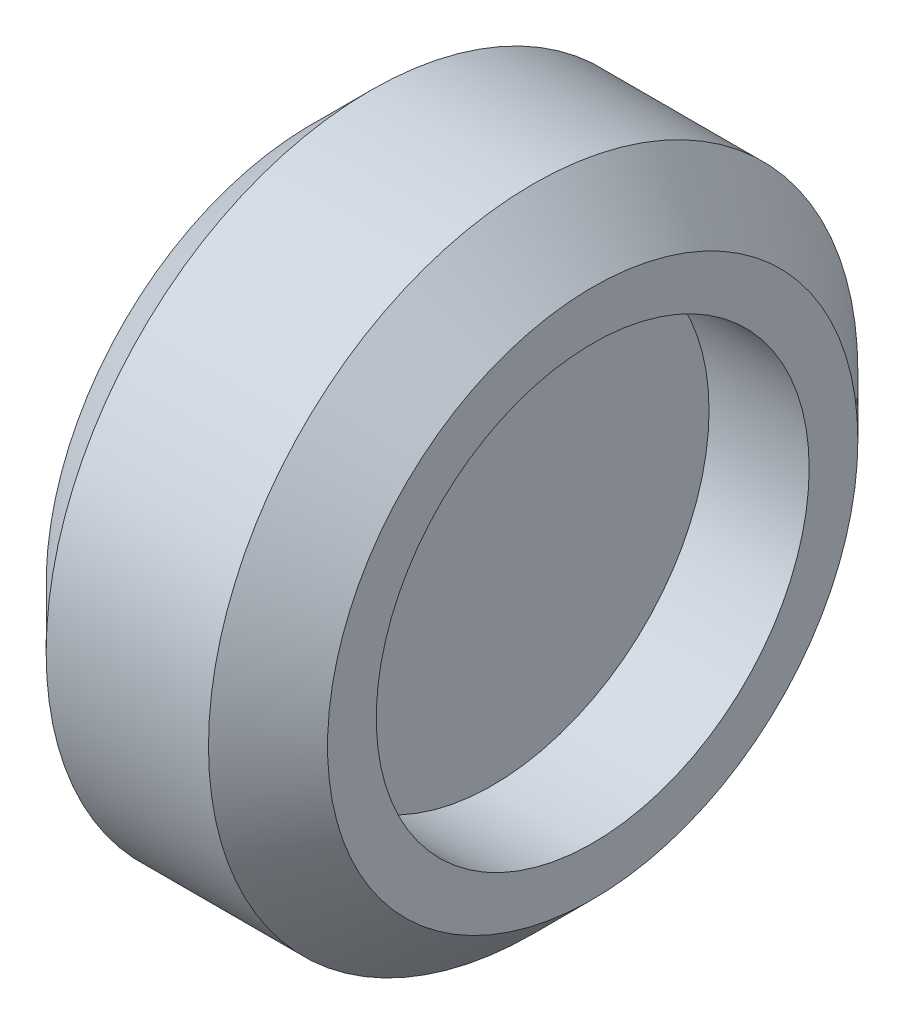
ISO-10303-21;
HEADER;
FILE_DESCRIPTION(('STEP AP214'),'2;1');
FILE_NAME('part.step','',(''),(''),'','','');
FILE_SCHEMA(('AUTOMOTIVE_DESIGN { 1 0 10303 214 1 1 1 1 }'));
ENDSEC;
DATA;
#1=APPLICATION_CONTEXT('core data for automotive mechanical design processes');
#2=APPLICATION_PROTOCOL_DEFINITION('international standard','automotive_design',2000,#1);
#3=PRODUCT_CONTEXT('',#1,'mechanical');
#4=PRODUCT('Part','Part','',(#3));
#5=PRODUCT_RELATED_PRODUCT_CATEGORY('part','',(#4));
#6=PRODUCT_DEFINITION_FORMATION('','',#4);
#7=PRODUCT_DEFINITION_CONTEXT('part definition',#1,'design');
#8=PRODUCT_DEFINITION('design','',#6,#7);
#9=PRODUCT_DEFINITION_SHAPE('','',#8);
#10=(LENGTH_UNIT() NAMED_UNIT(*) SI_UNIT(.MILLI.,.METRE.));
#11=(NAMED_UNIT(*) PLANE_ANGLE_UNIT() SI_UNIT($,.RADIAN.));
#12=(NAMED_UNIT(*) SI_UNIT($,.STERADIAN.) SOLID_ANGLE_UNIT());
#13=UNCERTAINTY_MEASURE_WITH_UNIT(LENGTH_MEASURE(1.E-05),#10,'distance_accuracy_value','');
#14=(GEOMETRIC_REPRESENTATION_CONTEXT(3) GLOBAL_UNCERTAINTY_ASSIGNED_CONTEXT((#13)) GLOBAL_UNIT_ASSIGNED_CONTEXT((#10,
#11,#12)) REPRESENTATION_CONTEXT('',''));
#15=CARTESIAN_POINT('',(0.,0.,0.));
#16=DIRECTION('',(0.,0.,1.));
#17=DIRECTION('',(1.,0.,0.));
#18=AXIS2_PLACEMENT_3D('',#15,#16,#17);
#19=CARTESIAN_POINT('',(0.,0.,0.));
#20=DIRECTION('',(-1.,0.,0.));
#21=DIRECTION('',(0.,0.,1.));
#22=AXIS2_PLACEMENT_3D('',#19,#20,#21);
#23=CYLINDRICAL_SURFACE('',#22,12.);
#24=CARTESIAN_POINT('',(-3.,0.,0.));
#25=DIRECTION('',(-1.,0.,0.));
#26=DIRECTION('',(0.,0.,1.));
#27=AXIS2_PLACEMENT_3D('',#24,#25,#26);
#28=CIRCLE('',#27,12.);
#29=CARTESIAN_POINT('',(-3.,0.,-12.));
#30=VERTEX_POINT('',#29);
#31=EDGE_CURVE('E75',#30,#30,#28,.T.);
#32=ORIENTED_EDGE('',*,*,#31,.F.);
#33=DIRECTION('',(1.,0.,0.));
#34=VECTOR('',#33,1.);
#35=CARTESIAN_POINT('',(0.,0.,-12.));
#36=LINE('',#35,#34);
#37=CARTESIAN_POINT('',(3.,0.,-12.));
#38=VERTEX_POINT('',#37);
#39=EDGE_CURVE('E11',#30,#38,#36,.T.);
#40=ORIENTED_EDGE('',*,*,#39,.T.);
#41=CARTESIAN_POINT('',(3.,0.,0.));
#42=DIRECTION('',(-1.,0.,0.));
#43=DIRECTION('',(0.,0.,1.));
#44=AXIS2_PLACEMENT_3D('',#41,#42,#43);
#45=CIRCLE('',#44,12.);
#46=EDGE_CURVE('E95',#38,#38,#45,.T.);
#47=ORIENTED_EDGE('',*,*,#46,.T.);
#48=ORIENTED_EDGE('',*,*,#39,.F.);
#49=EDGE_LOOP('',(#32,#40,#47,#48));
#50=FACE_BOUND('',#49,.T.);
#51=ADVANCED_FACE('F19',(#50),#23,.T.);
#52=CARTESIAN_POINT('',(4.1,0.,0.));
#53=DIRECTION('',(-1.,0.,0.));
#54=DIRECTION('',(0.,0.,1.));
#55=AXIS2_PLACEMENT_3D('',#52,#53,#54);
#56=CONICAL_SURFACE('',#55,10.9000000614673,0.785398135457771);
#57=ORIENTED_EDGE('',*,*,#46,.F.);
#58=DIRECTION('',(0.707106800942882,0.,0.707106761430212));
#59=VECTOR('',#58,1.);
#60=CARTESIAN_POINT('',(4.1,0.,-10.9000000614673));
#61=LINE('',#60,#59);
#62=CARTESIAN_POINT('',(5.2,0.,-9.80000012293458));
#63=VERTEX_POINT('',#62);
#64=EDGE_CURVE('E30',#38,#63,#61,.T.);
#65=ORIENTED_EDGE('',*,*,#64,.T.);
#66=CARTESIAN_POINT('',(5.2,0.,0.));
#67=DIRECTION('',(-1.,0.,0.));
#68=DIRECTION('',(0.,0.,1.));
#69=AXIS2_PLACEMENT_3D('',#66,#67,#68);
#70=CIRCLE('',#69,9.80000012293458);
#71=EDGE_CURVE('E23',#63,#63,#70,.T.);
#72=ORIENTED_EDGE('',*,*,#71,.T.);
#73=ORIENTED_EDGE('',*,*,#64,.F.);
#74=EDGE_LOOP('',(#57,#65,#72,#73));
#75=FACE_BOUND('',#74,.T.);
#76=ADVANCED_FACE('F130',(#75),#56,.T.);
#77=CARTESIAN_POINT('',(5.2,0.,9.80000012293458));
#78=DIRECTION('',(1.,0.,0.));
#79=DIRECTION('',(0.,1.,0.));
#80=AXIS2_PLACEMENT_3D('',#77,#78,#79);
#81=PLANE('',#80);
#82=CARTESIAN_POINT('',(5.2,0.,0.));
#83=DIRECTION('',(-1.,0.,0.));
#84=DIRECTION('',(0.,0.,1.));
#85=AXIS2_PLACEMENT_3D('',#82,#83,#84);
#86=CIRCLE('',#85,8.);
#87=CARTESIAN_POINT('',(5.2,0.,-8.));
#88=VERTEX_POINT('',#87);
#89=EDGE_CURVE('E111',#88,#88,#86,.T.);
#90=ORIENTED_EDGE('',*,*,#89,.T.);
#91=EDGE_LOOP('',(#90));
#92=FACE_BOUND('',#91,.T.);
#93=ORIENTED_EDGE('',*,*,#71,.F.);
#94=EDGE_LOOP('',(#93));
#95=FACE_BOUND('',#94,.T.);
#96=ADVANCED_FACE('F132',(#92,#95),#81,.T.);
#97=CARTESIAN_POINT('',(3.3500000112,0.,0.));
#98=DIRECTION('',(-1.,0.,0.));
#99=DIRECTION('',(0.,0.,1.));
#100=AXIS2_PLACEMENT_3D('',#97,#98,#99);
#101=CYLINDRICAL_SURFACE('',#100,8.);
#102=CARTESIAN_POINT('',(1.5000000224,0.,0.));
#103=DIRECTION('',(-1.,0.,0.));
#104=DIRECTION('',(0.,0.,1.));
#105=AXIS2_PLACEMENT_3D('',#102,#103,#104);
#106=CIRCLE('',#105,8.);
#107=CARTESIAN_POINT('',(1.5000000224,0.,-8.));
#108=VERTEX_POINT('',#107);
#109=EDGE_CURVE('E100',#108,#108,#106,.T.);
#110=ORIENTED_EDGE('',*,*,#109,.T.);
#111=DIRECTION('',(1.,0.,0.));
#112=VECTOR('',#111,1.);
#113=CARTESIAN_POINT('',(3.3500000112,0.,-8.));
#114=LINE('',#113,#112);
#115=EDGE_CURVE('E103',#108,#88,#114,.T.);
#116=ORIENTED_EDGE('',*,*,#115,.T.);
#117=ORIENTED_EDGE('',*,*,#89,.F.);
#118=ORIENTED_EDGE('',*,*,#115,.F.);
#119=EDGE_LOOP('',(#110,#116,#117,#118));
#120=FACE_BOUND('',#119,.T.);
#121=ADVANCED_FACE('F134',(#120),#101,.F.);
#122=CARTESIAN_POINT('',(1.5000000224,0.,8.));
#123=DIRECTION('',(1.,0.,0.));
#124=DIRECTION('',(0.,1.,0.));
#125=AXIS2_PLACEMENT_3D('',#122,#123,#124);
#126=PLANE('',#125);
#127=ORIENTED_EDGE('',*,*,#109,.F.);
#128=EDGE_LOOP('',(#127));
#129=FACE_BOUND('',#128,.T.);
#130=ADVANCED_FACE('F141',(#129),#126,.T.);
#131=CARTESIAN_POINT('',(-1.5000000224,0.,0.));
#132=DIRECTION('',(-1.,0.,0.));
#133=DIRECTION('',(0.,0.,1.));
#134=AXIS2_PLACEMENT_3D('',#131,#132,#133);
#135=PLANE('',#134);
#136=CARTESIAN_POINT('',(-1.5000000224,0.,0.));
#137=DIRECTION('',(-1.,0.,0.));
#138=DIRECTION('',(0.,0.,1.));
#139=AXIS2_PLACEMENT_3D('',#136,#137,#138);
#140=CIRCLE('',#139,8.);
#141=CARTESIAN_POINT('',(-1.5000000224,0.,-8.));
#142=VERTEX_POINT('',#141);
#143=EDGE_CURVE('E94',#142,#142,#140,.T.);
#144=ORIENTED_EDGE('',*,*,#143,.T.);
#145=EDGE_LOOP('',(#144));
#146=FACE_BOUND('',#145,.T.);
#147=ADVANCED_FACE('F151',(#146),#135,.T.);
#148=CARTESIAN_POINT('',(-3.3500000112,0.,0.));
#149=DIRECTION('',(-1.,0.,0.));
#150=DIRECTION('',(0.,0.,1.));
#151=AXIS2_PLACEMENT_3D('',#148,#149,#150);
#152=CYLINDRICAL_SURFACE('',#151,8.);
#153=CARTESIAN_POINT('',(-5.2,0.,0.));
#154=DIRECTION('',(-1.,0.,0.));
#155=DIRECTION('',(0.,0.,1.));
#156=AXIS2_PLACEMENT_3D('',#153,#154,#155);
#157=CIRCLE('',#156,8.);
#158=CARTESIAN_POINT('',(-5.2,0.,-8.));
#159=VERTEX_POINT('',#158);
#160=EDGE_CURVE('E89',#159,#159,#157,.T.);
#161=ORIENTED_EDGE('',*,*,#160,.T.);
#162=DIRECTION('',(1.,0.,0.));
#163=VECTOR('',#162,1.);
#164=CARTESIAN_POINT('',(-3.3500000112,0.,-8.));
#165=LINE('',#164,#163);
#166=EDGE_CURVE('E90',#159,#142,#165,.T.);
#167=ORIENTED_EDGE('',*,*,#166,.T.);
#168=ORIENTED_EDGE('',*,*,#143,.F.);
#169=ORIENTED_EDGE('',*,*,#166,.F.);
#170=EDGE_LOOP('',(#161,#167,#168,#169));
#171=FACE_BOUND('',#170,.T.);
#172=ADVANCED_FACE('F154',(#171),#152,.F.);
#173=CARTESIAN_POINT('',(-5.2,0.,8.));
#174=DIRECTION('',(-1.,0.,0.));
#175=DIRECTION('',(0.,0.,1.));
#176=AXIS2_PLACEMENT_3D('',#173,#174,#175);
#177=PLANE('',#176);
#178=ORIENTED_EDGE('',*,*,#160,.F.);
#179=EDGE_LOOP('',(#178));
#180=FACE_BOUND('',#179,.T.);
#181=CARTESIAN_POINT('',(-5.2,0.,0.));
#182=DIRECTION('',(-1.,0.,0.));
#183=DIRECTION('',(0.,0.,1.));
#184=AXIS2_PLACEMENT_3D('',#181,#182,#183);
#185=CIRCLE('',#184,9.80000012293458);
#186=CARTESIAN_POINT('',(-5.2,0.,-9.80000012293458));
#187=VERTEX_POINT('',#186);
#188=EDGE_CURVE('E74',#187,#187,#185,.T.);
#189=ORIENTED_EDGE('',*,*,#188,.T.);
#190=EDGE_LOOP('',(#189));
#191=FACE_BOUND('',#190,.T.);
#192=ADVANCED_FACE('F21',(#180,#191),#177,.T.);
#193=CARTESIAN_POINT('',(-4.1,0.,0.));
#194=DIRECTION('',(1.,0.,0.));
#195=DIRECTION('',(0.,0.,1.));
#196=AXIS2_PLACEMENT_3D('',#193,#194,#195);
#197=CONICAL_SURFACE('',#196,10.9000000614673,0.785398135457771);
#198=ORIENTED_EDGE('',*,*,#188,.F.);
#199=DIRECTION('',(0.707106800942882,0.,-0.707106761430212));
#200=VECTOR('',#199,1.);
#201=CARTESIAN_POINT('',(-4.1,0.,-10.9000000614673));
#202=LINE('',#201,#200);
#203=EDGE_CURVE('E71',#187,#30,#202,.T.);
#204=ORIENTED_EDGE('',*,*,#203,.T.);
#205=ORIENTED_EDGE('',*,*,#31,.T.);
#206=ORIENTED_EDGE('',*,*,#203,.F.);
#207=EDGE_LOOP('',(#198,#204,#205,#206));
#208=FACE_BOUND('',#207,.T.);
#209=ADVANCED_FACE('F73',(#208),#197,.T.);
#210=CLOSED_SHELL('',(#51,#76,#96,#121,#130,#147,#172,#192,#209));
#211=MANIFOLD_SOLID_BREP('B1',#210);
#212=ADVANCED_BREP_SHAPE_REPRESENTATION('',(#18,#211),#14);
#213=SHAPE_DEFINITION_REPRESENTATION(#9,#212);
ENDSEC;
END-ISO-10303-21;
